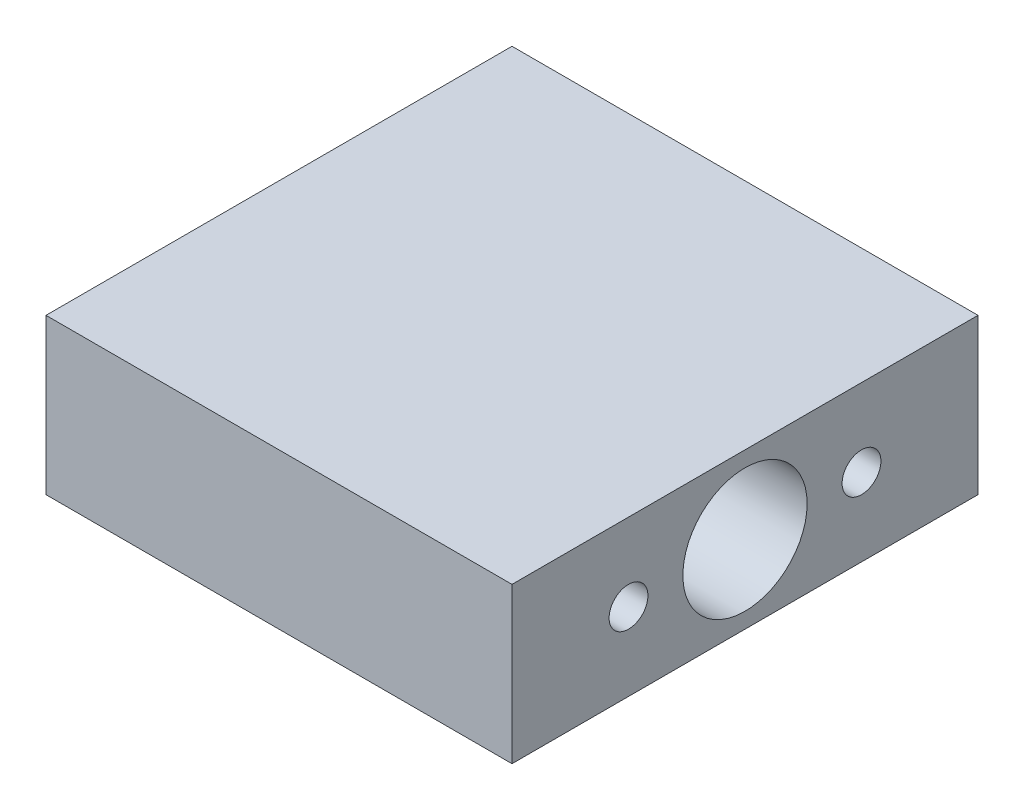
ISO-10303-21;
HEADER;
FILE_DESCRIPTION(('STEP AP214'),'2;1');
FILE_NAME('part.step','',(''),(''),'','','');
FILE_SCHEMA(('AUTOMOTIVE_DESIGN { 1 0 10303 214 1 1 1 1 }'));
ENDSEC;
DATA;
#1=APPLICATION_CONTEXT('core data for automotive mechanical design processes');
#2=APPLICATION_PROTOCOL_DEFINITION('international standard','automotive_design',2000,#1);
#3=PRODUCT_CONTEXT('',#1,'mechanical');
#4=PRODUCT('Part','Part','',(#3));
#5=PRODUCT_RELATED_PRODUCT_CATEGORY('part','',(#4));
#6=PRODUCT_DEFINITION_FORMATION('','',#4);
#7=PRODUCT_DEFINITION_CONTEXT('part definition',#1,'design');
#8=PRODUCT_DEFINITION('design','',#6,#7);
#9=PRODUCT_DEFINITION_SHAPE('','',#8);
#10=(LENGTH_UNIT() NAMED_UNIT(*) SI_UNIT(.MILLI.,.METRE.));
#11=(NAMED_UNIT(*) PLANE_ANGLE_UNIT() SI_UNIT($,.RADIAN.));
#12=(NAMED_UNIT(*) SI_UNIT($,.STERADIAN.) SOLID_ANGLE_UNIT());
#13=UNCERTAINTY_MEASURE_WITH_UNIT(LENGTH_MEASURE(1.E-05),#10,'distance_accuracy_value','');
#14=(GEOMETRIC_REPRESENTATION_CONTEXT(3) GLOBAL_UNCERTAINTY_ASSIGNED_CONTEXT((#13)) GLOBAL_UNIT_ASSIGNED_CONTEXT((#10,
#11,#12)) REPRESENTATION_CONTEXT('',''));
#15=CARTESIAN_POINT('',(0.,0.,0.));
#16=DIRECTION('',(0.,0.,1.));
#17=DIRECTION('',(1.,0.,0.));
#18=AXIS2_PLACEMENT_3D('',#15,#16,#17);
#19=CARTESIAN_POINT('',(38.1,0.,0.));
#20=DIRECTION('',(0.,0.,-1.));
#21=DIRECTION('',(-1.,0.,0.));
#22=AXIS2_PLACEMENT_3D('',#19,#20,#21);
#23=PLANE('',#22);
#24=DIRECTION('',(0.,-1.,0.));
#25=VECTOR('',#24,1.);
#26=CARTESIAN_POINT('',(0.,0.,0.));
#27=LINE('',#26,#25);
#28=CARTESIAN_POINT('',(0.,12.7,0.));
#29=VERTEX_POINT('',#28);
#30=CARTESIAN_POINT('',(0.,0.,0.));
#31=VERTEX_POINT('',#30);
#32=EDGE_CURVE('E107',#29,#31,#27,.T.);
#33=ORIENTED_EDGE('',*,*,#32,.T.);
#34=DIRECTION('',(-1.,0.,0.));
#35=VECTOR('',#34,1.);
#36=CARTESIAN_POINT('',(38.1,0.,0.));
#37=LINE('',#36,#35);
#38=CARTESIAN_POINT('',(38.1,0.,0.));
#39=VERTEX_POINT('',#38);
#40=EDGE_CURVE('E11',#39,#31,#37,.T.);
#41=ORIENTED_EDGE('',*,*,#40,.F.);
#42=DIRECTION('',(0.,-1.,0.));
#43=VECTOR('',#42,1.);
#44=CARTESIAN_POINT('',(38.1,0.,0.));
#45=LINE('',#44,#43);
#46=CARTESIAN_POINT('',(38.1,12.7,0.));
#47=VERTEX_POINT('',#46);
#48=EDGE_CURVE('E91',#47,#39,#45,.T.);
#49=ORIENTED_EDGE('',*,*,#48,.F.);
#50=DIRECTION('',(-1.,0.,0.));
#51=VECTOR('',#50,1.);
#52=CARTESIAN_POINT('',(38.1,12.7,0.));
#53=LINE('',#52,#51);
#54=EDGE_CURVE('E103',#47,#29,#53,.T.);
#55=ORIENTED_EDGE('',*,*,#54,.T.);
#56=EDGE_LOOP('',(#33,#41,#49,#55));
#57=FACE_BOUND('',#56,.T.);
#58=ADVANCED_FACE('F39',(#57),#23,.F.);
#59=CARTESIAN_POINT('',(38.1,0.,0.));
#60=DIRECTION('',(0.,1.,0.));
#61=DIRECTION('',(0.,0.,1.));
#62=AXIS2_PLACEMENT_3D('',#59,#60,#61);
#63=PLANE('',#62);
#64=DIRECTION('',(0.,0.,-1.));
#65=VECTOR('',#64,1.);
#66=CARTESIAN_POINT('',(0.,0.,0.));
#67=LINE('',#66,#65);
#68=CARTESIAN_POINT('',(0.,0.,-38.1));
#69=VERTEX_POINT('',#68);
#70=EDGE_CURVE('E96',#31,#69,#67,.T.);
#71=ORIENTED_EDGE('',*,*,#70,.T.);
#72=DIRECTION('',(-1.,0.,0.));
#73=VECTOR('',#72,1.);
#74=CARTESIAN_POINT('',(38.1,0.,-38.1));
#75=LINE('',#74,#73);
#76=CARTESIAN_POINT('',(38.1,0.,-38.1));
#77=VERTEX_POINT('',#76);
#78=EDGE_CURVE('E48',#77,#69,#75,.T.);
#79=ORIENTED_EDGE('',*,*,#78,.F.);
#80=DIRECTION('',(0.,0.,-1.));
#81=VECTOR('',#80,1.);
#82=CARTESIAN_POINT('',(38.1,0.,0.));
#83=LINE('',#82,#81);
#84=EDGE_CURVE('E86',#39,#77,#83,.T.);
#85=ORIENTED_EDGE('',*,*,#84,.F.);
#86=ORIENTED_EDGE('',*,*,#40,.T.);
#87=EDGE_LOOP('',(#71,#79,#85,#86));
#88=FACE_BOUND('',#87,.T.);
#89=ADVANCED_FACE('F95',(#88),#63,.F.);
#90=CARTESIAN_POINT('',(38.1,0.,-38.1));
#91=DIRECTION('',(0.,0.,1.));
#92=DIRECTION('',(1.,0.,0.));
#93=AXIS2_PLACEMENT_3D('',#90,#91,#92);
#94=PLANE('',#93);
#95=DIRECTION('',(0.,1.,0.));
#96=VECTOR('',#95,1.);
#97=CARTESIAN_POINT('',(0.,0.,-38.1));
#98=LINE('',#97,#96);
#99=CARTESIAN_POINT('',(0.,12.7,-38.1));
#100=VERTEX_POINT('',#99);
#101=EDGE_CURVE('E73',#69,#100,#98,.T.);
#102=ORIENTED_EDGE('',*,*,#101,.T.);
#103=DIRECTION('',(-1.,0.,0.));
#104=VECTOR('',#103,1.);
#105=CARTESIAN_POINT('',(38.1,12.7,-38.1));
#106=LINE('',#105,#104);
#107=CARTESIAN_POINT('',(38.1,12.7,-38.1));
#108=VERTEX_POINT('',#107);
#109=EDGE_CURVE('E98',#108,#100,#106,.T.);
#110=ORIENTED_EDGE('',*,*,#109,.F.);
#111=DIRECTION('',(0.,1.,0.));
#112=VECTOR('',#111,1.);
#113=CARTESIAN_POINT('',(38.1,0.,-38.1));
#114=LINE('',#113,#112);
#115=EDGE_CURVE('E89',#77,#108,#114,.T.);
#116=ORIENTED_EDGE('',*,*,#115,.F.);
#117=ORIENTED_EDGE('',*,*,#78,.T.);
#118=EDGE_LOOP('',(#102,#110,#116,#117));
#119=FACE_BOUND('',#118,.T.);
#120=ADVANCED_FACE('F99',(#119),#94,.F.);
#121=CARTESIAN_POINT('',(38.1,12.7,0.));
#122=DIRECTION('',(0.,-1.,0.));
#123=DIRECTION('',(0.,0.,-1.));
#124=AXIS2_PLACEMENT_3D('',#121,#122,#123);
#125=PLANE('',#124);
#126=DIRECTION('',(0.,0.,1.));
#127=VECTOR('',#126,1.);
#128=CARTESIAN_POINT('',(0.,12.7,0.));
#129=LINE('',#128,#127);
#130=EDGE_CURVE('E79',#100,#29,#129,.T.);
#131=ORIENTED_EDGE('',*,*,#130,.T.);
#132=ORIENTED_EDGE('',*,*,#54,.F.);
#133=DIRECTION('',(0.,0.,1.));
#134=VECTOR('',#133,1.);
#135=CARTESIAN_POINT('',(38.1,12.7,0.));
#136=LINE('',#135,#134);
#137=EDGE_CURVE('E56',#108,#47,#136,.T.);
#138=ORIENTED_EDGE('',*,*,#137,.F.);
#139=ORIENTED_EDGE('',*,*,#109,.T.);
#140=EDGE_LOOP('',(#131,#132,#138,#139));
#141=FACE_BOUND('',#140,.T.);
#142=ADVANCED_FACE('F121',(#141),#125,.F.);
#143=CARTESIAN_POINT('',(38.1,0.,0.));
#144=DIRECTION('',(-1.,0.,0.));
#145=DIRECTION('',(0.,0.,1.));
#146=AXIS2_PLACEMENT_3D('',#143,#144,#145);
#147=PLANE('',#146);
#148=CARTESIAN_POINT('',(38.1,6.35,-28.575));
#149=DIRECTION('',(1.,0.,0.));
#150=DIRECTION('',(0.,0.,1.));
#151=AXIS2_PLACEMENT_3D('',#148,#149,#150);
#152=CIRCLE('',#151,1.5875);
#153=CARTESIAN_POINT('',(38.1,6.35,-30.1625));
#154=VERTEX_POINT('',#153);
#155=EDGE_CURVE('E136',#154,#154,#152,.T.);
#156=ORIENTED_EDGE('',*,*,#155,.F.);
#157=EDGE_LOOP('',(#156));
#158=FACE_BOUND('',#157,.T.);
#159=CARTESIAN_POINT('',(38.1,6.35,-9.525));
#160=DIRECTION('',(1.,0.,0.));
#161=DIRECTION('',(0.,0.,-1.));
#162=AXIS2_PLACEMENT_3D('',#159,#160,#161);
#163=CIRCLE('',#162,1.5875);
#164=CARTESIAN_POINT('',(38.1,6.35,-11.1125));
#165=VERTEX_POINT('',#164);
#166=EDGE_CURVE('E144',#165,#165,#163,.T.);
#167=ORIENTED_EDGE('',*,*,#166,.F.);
#168=EDGE_LOOP('',(#167));
#169=FACE_BOUND('',#168,.T.);
#170=CARTESIAN_POINT('',(38.1,6.35,-19.05));
#171=DIRECTION('',(1.,0.,0.));
#172=DIRECTION('',(0.,0.,-1.));
#173=AXIS2_PLACEMENT_3D('',#170,#171,#172);
#174=CIRCLE('',#173,5.08);
#175=CARTESIAN_POINT('',(38.1,6.35,-24.13));
#176=VERTEX_POINT('',#175);
#177=EDGE_CURVE('E128',#176,#176,#174,.T.);
#178=ORIENTED_EDGE('',*,*,#177,.F.);
#179=EDGE_LOOP('',(#178));
#180=FACE_BOUND('',#179,.T.);
#181=ORIENTED_EDGE('',*,*,#48,.T.);
#182=ORIENTED_EDGE('',*,*,#84,.T.);
#183=ORIENTED_EDGE('',*,*,#115,.T.);
#184=ORIENTED_EDGE('',*,*,#137,.T.);
#185=EDGE_LOOP('',(#181,#182,#183,#184));
#186=FACE_BOUND('',#185,.T.);
#187=ADVANCED_FACE('F87',(#158,#169,#180,#186),#147,.F.);
#188=CARTESIAN_POINT('',(0.,0.,0.));
#189=DIRECTION('',(-1.,0.,0.));
#190=DIRECTION('',(0.,0.,1.));
#191=AXIS2_PLACEMENT_3D('',#188,#189,#190);
#192=PLANE('',#191);
#193=CARTESIAN_POINT('',(0.,6.35,-28.575));
#194=DIRECTION('',(1.,0.,0.));
#195=DIRECTION('',(0.,0.,1.));
#196=AXIS2_PLACEMENT_3D('',#193,#194,#195);
#197=CIRCLE('',#196,1.5875);
#198=CARTESIAN_POINT('',(0.,6.35,-30.1625));
#199=VERTEX_POINT('',#198);
#200=EDGE_CURVE('E140',#199,#199,#197,.T.);
#201=ORIENTED_EDGE('',*,*,#200,.T.);
#202=EDGE_LOOP('',(#201));
#203=FACE_BOUND('',#202,.T.);
#204=CARTESIAN_POINT('',(0.,6.35,-9.525));
#205=DIRECTION('',(1.,0.,0.));
#206=DIRECTION('',(0.,0.,-1.));
#207=AXIS2_PLACEMENT_3D('',#204,#205,#206);
#208=CIRCLE('',#207,1.5875);
#209=CARTESIAN_POINT('',(0.,6.35,-11.1125));
#210=VERTEX_POINT('',#209);
#211=EDGE_CURVE('E132',#210,#210,#208,.T.);
#212=ORIENTED_EDGE('',*,*,#211,.T.);
#213=EDGE_LOOP('',(#212));
#214=FACE_BOUND('',#213,.T.);
#215=CARTESIAN_POINT('',(0.,6.35,-19.05));
#216=DIRECTION('',(1.,0.,0.));
#217=DIRECTION('',(0.,0.,-1.));
#218=AXIS2_PLACEMENT_3D('',#215,#216,#217);
#219=CIRCLE('',#218,5.08);
#220=CARTESIAN_POINT('',(0.,6.35,-24.13));
#221=VERTEX_POINT('',#220);
#222=EDGE_CURVE('E111',#221,#221,#219,.T.);
#223=ORIENTED_EDGE('',*,*,#222,.T.);
#224=EDGE_LOOP('',(#223));
#225=FACE_BOUND('',#224,.T.);
#226=ORIENTED_EDGE('',*,*,#32,.F.);
#227=ORIENTED_EDGE('',*,*,#130,.F.);
#228=ORIENTED_EDGE('',*,*,#101,.F.);
#229=ORIENTED_EDGE('',*,*,#70,.F.);
#230=EDGE_LOOP('',(#226,#227,#228,#229));
#231=FACE_BOUND('',#230,.T.);
#232=ADVANCED_FACE('F124',(#203,#214,#225,#231),#192,.T.);
#233=CARTESIAN_POINT('',(0.,6.35,-19.05));
#234=DIRECTION('',(1.,0.,0.));
#235=DIRECTION('',(0.,0.,-1.));
#236=AXIS2_PLACEMENT_3D('',#233,#234,#235);
#237=CYLINDRICAL_SURFACE('',#236,5.08);
#238=CARTESIAN_POINT('',(0.,6.35,-24.13));
#239=CARTESIAN_POINT('',(0.396875,6.35,-24.13));
#240=CARTESIAN_POINT('',(0.79375,6.35,-24.13));
#241=CARTESIAN_POINT('',(1.5875,6.35,-24.13));
#242=CARTESIAN_POINT('',(1.984375,6.35,-24.13));
#243=CARTESIAN_POINT('',(2.778125,6.35,-24.13));
#244=CARTESIAN_POINT('',(3.175,6.35,-24.13));
#245=CARTESIAN_POINT('',(3.96875,6.35,-24.13));
#246=CARTESIAN_POINT('',(4.365625,6.35,-24.13));
#247=CARTESIAN_POINT('',(5.159375,6.35,-24.13));
#248=CARTESIAN_POINT('',(5.55625,6.35,-24.13));
#249=CARTESIAN_POINT('',(6.35,6.35,-24.13));
#250=CARTESIAN_POINT('',(6.746875,6.35,-24.13));
#251=CARTESIAN_POINT('',(7.540625,6.35,-24.13));
#252=CARTESIAN_POINT('',(7.9375,6.35,-24.13));
#253=CARTESIAN_POINT('',(8.73125,6.35,-24.13));
#254=CARTESIAN_POINT('',(9.128125,6.35,-24.13));
#255=CARTESIAN_POINT('',(9.921875,6.35,-24.13));
#256=CARTESIAN_POINT('',(10.31875,6.35,-24.13));
#257=CARTESIAN_POINT('',(11.1125,6.35,-24.13));
#258=CARTESIAN_POINT('',(11.509375,6.35,-24.13));
#259=CARTESIAN_POINT('',(12.303125,6.35,-24.13));
#260=CARTESIAN_POINT('',(12.7,6.35,-24.13));
#261=CARTESIAN_POINT('',(13.49375,6.35,-24.13));
#262=CARTESIAN_POINT('',(13.890625,6.35,-24.13));
#263=CARTESIAN_POINT('',(14.684375,6.35,-24.13));
#264=CARTESIAN_POINT('',(15.08125,6.35,-24.13));
#265=CARTESIAN_POINT('',(15.875,6.35,-24.13));
#266=CARTESIAN_POINT('',(16.271875,6.35,-24.13));
#267=CARTESIAN_POINT('',(17.065625,6.35,-24.13));
#268=CARTESIAN_POINT('',(17.4625,6.35,-24.13));
#269=CARTESIAN_POINT('',(18.25625,6.35,-24.13));
#270=CARTESIAN_POINT('',(18.653125,6.35,-24.13));
#271=CARTESIAN_POINT('',(19.446875,6.35,-24.13));
#272=CARTESIAN_POINT('',(19.84375,6.35,-24.13));
#273=CARTESIAN_POINT('',(20.6375,6.35,-24.13));
#274=CARTESIAN_POINT('',(21.034375,6.35,-24.13));
#275=CARTESIAN_POINT('',(21.828125,6.35,-24.13));
#276=CARTESIAN_POINT('',(22.225,6.35,-24.13));
#277=CARTESIAN_POINT('',(23.01875,6.35,-24.13));
#278=CARTESIAN_POINT('',(23.415625,6.35,-24.13));
#279=CARTESIAN_POINT('',(24.209375,6.35,-24.13));
#280=CARTESIAN_POINT('',(24.60625,6.35,-24.13));
#281=CARTESIAN_POINT('',(25.4,6.35,-24.13));
#282=CARTESIAN_POINT('',(25.796875,6.35,-24.13));
#283=CARTESIAN_POINT('',(26.590625,6.35,-24.13));
#284=CARTESIAN_POINT('',(26.9875,6.35,-24.13));
#285=CARTESIAN_POINT('',(27.78125,6.35,-24.13));
#286=CARTESIAN_POINT('',(28.178125,6.35,-24.13));
#287=CARTESIAN_POINT('',(28.971875,6.35,-24.13));
#288=CARTESIAN_POINT('',(29.36875,6.35,-24.13));
#289=CARTESIAN_POINT('',(30.1625,6.35,-24.13));
#290=CARTESIAN_POINT('',(30.559375,6.35,-24.13));
#291=CARTESIAN_POINT('',(31.353125,6.35,-24.13));
#292=CARTESIAN_POINT('',(31.75,6.35,-24.13));
#293=CARTESIAN_POINT('',(32.54375,6.35,-24.13));
#294=CARTESIAN_POINT('',(32.940625,6.35,-24.13));
#295=CARTESIAN_POINT('',(33.734375,6.35,-24.13));
#296=CARTESIAN_POINT('',(34.13125,6.35,-24.13));
#297=CARTESIAN_POINT('',(34.925,6.35,-24.13));
#298=CARTESIAN_POINT('',(35.321875,6.35,-24.13));
#299=CARTESIAN_POINT('',(36.115625,6.35,-24.13));
#300=CARTESIAN_POINT('',(36.5125,6.35,-24.13));
#301=CARTESIAN_POINT('',(37.30625,6.35,-24.13));
#302=CARTESIAN_POINT('',(37.703125,6.35,-24.13));
#303=CARTESIAN_POINT('',(38.1,6.35,-24.13));
#304=B_SPLINE_CURVE_WITH_KNOTS('',3,(#238,#239,#240,#241,#242,#243,#244,#245,#246,#247,#248,
#249,#250,#251,#252,#253,#254,#255,#256,#257,#258,#259,#260,#261,#262,#263,#264,#265,#266,#267,
#268,#269,#270,#271,#272,#273,#274,#275,#276,#277,#278,#279,#280,#281,#282,#283,#284,#285,#286,
#287,#288,#289,#290,#291,#292,#293,#294,#295,#296,#297,#298,#299,#300,#301,#302,#303),
.UNSPECIFIED.,.F.,.F.,(4,2,2,2,2,2,2,2,2,2,2,2,2,2,2,2,2,2,2,2,2,2,2,2,2,2,2,2,2,2,2,2,4),(0.,
1.190625,2.38125,3.571875,4.7625,5.953125,7.14375,8.334375,9.525,10.715625,11.90625,13.096875,
14.2875,15.478125,16.66875,17.859375,19.05,20.240625,21.43125,22.621875,23.8125,25.003125,
26.19375,27.384375,28.575,29.765625,30.95625,32.146875,33.3375,34.528125,35.71875,36.909375,
38.1),.UNSPECIFIED.);
#305=EDGE_CURVE('BSEAM158',#221,#176,#304,.T.);
#306=ORIENTED_EDGE('',*,*,#222,.F.);
#307=ORIENTED_EDGE('',*,*,#177,.T.);
#308=ORIENTED_EDGE('',*,*,#305,.T.);
#309=ORIENTED_EDGE('',*,*,#305,.F.);
#310=EDGE_LOOP('',(#306,#308,#307,#309));
#311=FACE_BOUND('',#310,.T.);
#312=ADVANCED_FACE('F158',(#311),#237,.F.);
#313=CARTESIAN_POINT('',(0.,6.35,-9.525));
#314=DIRECTION('',(1.,0.,0.));
#315=DIRECTION('',(0.,0.,-1.));
#316=AXIS2_PLACEMENT_3D('',#313,#314,#315);
#317=CYLINDRICAL_SURFACE('',#316,1.5875);
#318=CARTESIAN_POINT('',(0.,6.35,-11.1125));
#319=CARTESIAN_POINT('',(0.396875,6.35,-11.1125));
#320=CARTESIAN_POINT('',(0.79375,6.35,-11.1125));
#321=CARTESIAN_POINT('',(1.5875,6.35,-11.1125));
#322=CARTESIAN_POINT('',(1.984375,6.35,-11.1125));
#323=CARTESIAN_POINT('',(2.778125,6.35,-11.1125));
#324=CARTESIAN_POINT('',(3.175,6.35,-11.1125));
#325=CARTESIAN_POINT('',(3.96875,6.35,-11.1125));
#326=CARTESIAN_POINT('',(4.365625,6.35,-11.1125));
#327=CARTESIAN_POINT('',(5.159375,6.35,-11.1125));
#328=CARTESIAN_POINT('',(5.55625,6.35,-11.1125));
#329=CARTESIAN_POINT('',(6.35,6.35,-11.1125));
#330=CARTESIAN_POINT('',(6.746875,6.35,-11.1125));
#331=CARTESIAN_POINT('',(7.540625,6.35,-11.1125));
#332=CARTESIAN_POINT('',(7.9375,6.35,-11.1125));
#333=CARTESIAN_POINT('',(8.73125,6.35,-11.1125));
#334=CARTESIAN_POINT('',(9.128125,6.35,-11.1125));
#335=CARTESIAN_POINT('',(9.921875,6.35,-11.1125));
#336=CARTESIAN_POINT('',(10.31875,6.35,-11.1125));
#337=CARTESIAN_POINT('',(11.1125,6.35,-11.1125));
#338=CARTESIAN_POINT('',(11.509375,6.35,-11.1125));
#339=CARTESIAN_POINT('',(12.303125,6.35,-11.1125));
#340=CARTESIAN_POINT('',(12.7,6.35,-11.1125));
#341=CARTESIAN_POINT('',(13.49375,6.35,-11.1125));
#342=CARTESIAN_POINT('',(13.890625,6.35,-11.1125));
#343=CARTESIAN_POINT('',(14.684375,6.35,-11.1125));
#344=CARTESIAN_POINT('',(15.08125,6.35,-11.1125));
#345=CARTESIAN_POINT('',(15.875,6.35,-11.1125));
#346=CARTESIAN_POINT('',(16.271875,6.35,-11.1125));
#347=CARTESIAN_POINT('',(17.065625,6.35,-11.1125));
#348=CARTESIAN_POINT('',(17.4625,6.35,-11.1125));
#349=CARTESIAN_POINT('',(18.25625,6.35,-11.1125));
#350=CARTESIAN_POINT('',(18.653125,6.35,-11.1125));
#351=CARTESIAN_POINT('',(19.446875,6.35,-11.1125));
#352=CARTESIAN_POINT('',(19.84375,6.35,-11.1125));
#353=CARTESIAN_POINT('',(20.6375,6.35,-11.1125));
#354=CARTESIAN_POINT('',(21.034375,6.35,-11.1125));
#355=CARTESIAN_POINT('',(21.828125,6.35,-11.1125));
#356=CARTESIAN_POINT('',(22.225,6.35,-11.1125));
#357=CARTESIAN_POINT('',(23.01875,6.35,-11.1125));
#358=CARTESIAN_POINT('',(23.415625,6.35,-11.1125));
#359=CARTESIAN_POINT('',(24.209375,6.35,-11.1125));
#360=CARTESIAN_POINT('',(24.60625,6.35,-11.1125));
#361=CARTESIAN_POINT('',(25.4,6.35,-11.1125));
#362=CARTESIAN_POINT('',(25.796875,6.35,-11.1125));
#363=CARTESIAN_POINT('',(26.590625,6.35,-11.1125));
#364=CARTESIAN_POINT('',(26.9875,6.35,-11.1125));
#365=CARTESIAN_POINT('',(27.78125,6.35,-11.1125));
#366=CARTESIAN_POINT('',(28.178125,6.35,-11.1125));
#367=CARTESIAN_POINT('',(28.971875,6.35,-11.1125));
#368=CARTESIAN_POINT('',(29.36875,6.35,-11.1125));
#369=CARTESIAN_POINT('',(30.1625,6.35,-11.1125));
#370=CARTESIAN_POINT('',(30.559375,6.35,-11.1125));
#371=CARTESIAN_POINT('',(31.353125,6.35,-11.1125));
#372=CARTESIAN_POINT('',(31.75,6.35,-11.1125));
#373=CARTESIAN_POINT('',(32.54375,6.35,-11.1125));
#374=CARTESIAN_POINT('',(32.940625,6.35,-11.1125));
#375=CARTESIAN_POINT('',(33.734375,6.35,-11.1125));
#376=CARTESIAN_POINT('',(34.13125,6.35,-11.1125));
#377=CARTESIAN_POINT('',(34.925,6.35,-11.1125));
#378=CARTESIAN_POINT('',(35.321875,6.35,-11.1125));
#379=CARTESIAN_POINT('',(36.115625,6.35,-11.1125));
#380=CARTESIAN_POINT('',(36.5125,6.35,-11.1125));
#381=CARTESIAN_POINT('',(37.30625,6.35,-11.1125));
#382=CARTESIAN_POINT('',(37.703125,6.35,-11.1125));
#383=CARTESIAN_POINT('',(38.1,6.35,-11.1125));
#384=B_SPLINE_CURVE_WITH_KNOTS('',3,(#318,#319,#320,#321,#322,#323,#324,#325,#326,#327,#328,
#329,#330,#331,#332,#333,#334,#335,#336,#337,#338,#339,#340,#341,#342,#343,#344,#345,#346,#347,
#348,#349,#350,#351,#352,#353,#354,#355,#356,#357,#358,#359,#360,#361,#362,#363,#364,#365,#366,
#367,#368,#369,#370,#371,#372,#373,#374,#375,#376,#377,#378,#379,#380,#381,#382,#383),
.UNSPECIFIED.,.F.,.F.,(4,2,2,2,2,2,2,2,2,2,2,2,2,2,2,2,2,2,2,2,2,2,2,2,2,2,2,2,2,2,2,2,4),(0.,
1.190625,2.38125,3.571875,4.7625,5.953125,7.14375,8.334375,9.525,10.715625,11.90625,13.096875,
14.2875,15.478125,16.66875,17.859375,19.05,20.240625,21.43125,22.621875,23.8125,25.003125,
26.19375,27.384375,28.575,29.765625,30.95625,32.146875,33.3375,34.528125,35.71875,36.909375,
38.1),.UNSPECIFIED.);
#385=EDGE_CURVE('BSEAM154',#210,#165,#384,.T.);
#386=ORIENTED_EDGE('',*,*,#211,.F.);
#387=ORIENTED_EDGE('',*,*,#166,.T.);
#388=ORIENTED_EDGE('',*,*,#385,.T.);
#389=ORIENTED_EDGE('',*,*,#385,.F.);
#390=EDGE_LOOP('',(#386,#388,#387,#389));
#391=FACE_BOUND('',#390,.T.);
#392=ADVANCED_FACE('F154',(#391),#317,.F.);
#393=CARTESIAN_POINT('',(0.,6.35,-28.575));
#394=DIRECTION('',(1.,0.,0.));
#395=DIRECTION('',(0.,0.,-1.));
#396=AXIS2_PLACEMENT_3D('',#393,#394,#395);
#397=CYLINDRICAL_SURFACE('',#396,1.5875);
#398=CARTESIAN_POINT('',(0.,6.35,-30.1625));
#399=CARTESIAN_POINT('',(0.396875,6.35,-30.1625));
#400=CARTESIAN_POINT('',(0.79375,6.35,-30.1625));
#401=CARTESIAN_POINT('',(1.5875,6.35,-30.1625));
#402=CARTESIAN_POINT('',(1.984375,6.35,-30.1625));
#403=CARTESIAN_POINT('',(2.778125,6.35,-30.1625));
#404=CARTESIAN_POINT('',(3.175,6.35,-30.1625));
#405=CARTESIAN_POINT('',(3.96875,6.35,-30.1625));
#406=CARTESIAN_POINT('',(4.365625,6.35,-30.1625));
#407=CARTESIAN_POINT('',(5.159375,6.35,-30.1625));
#408=CARTESIAN_POINT('',(5.55625,6.35,-30.1625));
#409=CARTESIAN_POINT('',(6.35,6.35,-30.1625));
#410=CARTESIAN_POINT('',(6.746875,6.35,-30.1625));
#411=CARTESIAN_POINT('',(7.540625,6.35,-30.1625));
#412=CARTESIAN_POINT('',(7.9375,6.35,-30.1625));
#413=CARTESIAN_POINT('',(8.73125,6.35,-30.1625));
#414=CARTESIAN_POINT('',(9.128125,6.35,-30.1625));
#415=CARTESIAN_POINT('',(9.921875,6.35,-30.1625));
#416=CARTESIAN_POINT('',(10.31875,6.35,-30.1625));
#417=CARTESIAN_POINT('',(11.1125,6.35,-30.1625));
#418=CARTESIAN_POINT('',(11.509375,6.35,-30.1625));
#419=CARTESIAN_POINT('',(12.303125,6.35,-30.1625));
#420=CARTESIAN_POINT('',(12.7,6.35,-30.1625));
#421=CARTESIAN_POINT('',(13.49375,6.35,-30.1625));
#422=CARTESIAN_POINT('',(13.890625,6.35,-30.1625));
#423=CARTESIAN_POINT('',(14.684375,6.35,-30.1625));
#424=CARTESIAN_POINT('',(15.08125,6.35,-30.1625));
#425=CARTESIAN_POINT('',(15.875,6.35,-30.1625));
#426=CARTESIAN_POINT('',(16.271875,6.35,-30.1625));
#427=CARTESIAN_POINT('',(17.065625,6.35,-30.1625));
#428=CARTESIAN_POINT('',(17.4625,6.35,-30.1625));
#429=CARTESIAN_POINT('',(18.25625,6.35,-30.1625));
#430=CARTESIAN_POINT('',(18.653125,6.35,-30.1625));
#431=CARTESIAN_POINT('',(19.446875,6.35,-30.1625));
#432=CARTESIAN_POINT('',(19.84375,6.35,-30.1625));
#433=CARTESIAN_POINT('',(20.6375,6.35,-30.1625));
#434=CARTESIAN_POINT('',(21.034375,6.35,-30.1625));
#435=CARTESIAN_POINT('',(21.828125,6.35,-30.1625));
#436=CARTESIAN_POINT('',(22.225,6.35,-30.1625));
#437=CARTESIAN_POINT('',(23.01875,6.35,-30.1625));
#438=CARTESIAN_POINT('',(23.415625,6.35,-30.1625));
#439=CARTESIAN_POINT('',(24.209375,6.35,-30.1625));
#440=CARTESIAN_POINT('',(24.60625,6.35,-30.1625));
#441=CARTESIAN_POINT('',(25.4,6.35,-30.1625));
#442=CARTESIAN_POINT('',(25.796875,6.35,-30.1625));
#443=CARTESIAN_POINT('',(26.590625,6.35,-30.1625));
#444=CARTESIAN_POINT('',(26.9875,6.35,-30.1625));
#445=CARTESIAN_POINT('',(27.78125,6.35,-30.1625));
#446=CARTESIAN_POINT('',(28.178125,6.35,-30.1625));
#447=CARTESIAN_POINT('',(28.971875,6.35,-30.1625));
#448=CARTESIAN_POINT('',(29.36875,6.35,-30.1625));
#449=CARTESIAN_POINT('',(30.1625,6.35,-30.1625));
#450=CARTESIAN_POINT('',(30.559375,6.35,-30.1625));
#451=CARTESIAN_POINT('',(31.353125,6.35,-30.1625));
#452=CARTESIAN_POINT('',(31.75,6.35,-30.1625));
#453=CARTESIAN_POINT('',(32.54375,6.35,-30.1625));
#454=CARTESIAN_POINT('',(32.940625,6.35,-30.1625));
#455=CARTESIAN_POINT('',(33.734375,6.35,-30.1625));
#456=CARTESIAN_POINT('',(34.13125,6.35,-30.1625));
#457=CARTESIAN_POINT('',(34.925,6.35,-30.1625));
#458=CARTESIAN_POINT('',(35.321875,6.35,-30.1625));
#459=CARTESIAN_POINT('',(36.115625,6.35,-30.1625));
#460=CARTESIAN_POINT('',(36.5125,6.35,-30.1625));
#461=CARTESIAN_POINT('',(37.30625,6.35,-30.1625));
#462=CARTESIAN_POINT('',(37.703125,6.35,-30.1625));
#463=CARTESIAN_POINT('',(38.1,6.35,-30.1625));
#464=B_SPLINE_CURVE_WITH_KNOTS('',3,(#398,#399,#400,#401,#402,#403,#404,#405,#406,#407,#408,
#409,#410,#411,#412,#413,#414,#415,#416,#417,#418,#419,#420,#421,#422,#423,#424,#425,#426,#427,
#428,#429,#430,#431,#432,#433,#434,#435,#436,#437,#438,#439,#440,#441,#442,#443,#444,#445,#446,
#447,#448,#449,#450,#451,#452,#453,#454,#455,#456,#457,#458,#459,#460,#461,#462,#463),
.UNSPECIFIED.,.F.,.F.,(4,2,2,2,2,2,2,2,2,2,2,2,2,2,2,2,2,2,2,2,2,2,2,2,2,2,2,2,2,2,2,2,4),(0.,
1.190625,2.38125,3.571875,4.7625,5.953125,7.14375,8.334375,9.525,10.715625,11.90625,13.096875,
14.2875,15.478125,16.66875,17.859375,19.05,20.240625,21.43125,22.621875,23.8125,25.003125,
26.19375,27.384375,28.575,29.765625,30.95625,32.146875,33.3375,34.528125,35.71875,36.909375,
38.1),.UNSPECIFIED.);
#465=EDGE_CURVE('BSEAM157',#199,#154,#464,.T.);
#466=ORIENTED_EDGE('',*,*,#200,.F.);
#467=ORIENTED_EDGE('',*,*,#155,.T.);
#468=ORIENTED_EDGE('',*,*,#465,.T.);
#469=ORIENTED_EDGE('',*,*,#465,.F.);
#470=EDGE_LOOP('',(#466,#468,#467,#469));
#471=FACE_BOUND('',#470,.T.);
#472=ADVANCED_FACE('F157',(#471),#397,.F.);
#473=CLOSED_SHELL('',(#58,#89,#120,#142,#187,#232,#312,#392,#472));
#474=MANIFOLD_SOLID_BREP('B2',#473);
#475=ADVANCED_BREP_SHAPE_REPRESENTATION('',(#18,#474),#14);
#476=SHAPE_DEFINITION_REPRESENTATION(#9,#475);
ENDSEC;
END-ISO-10303-21;
